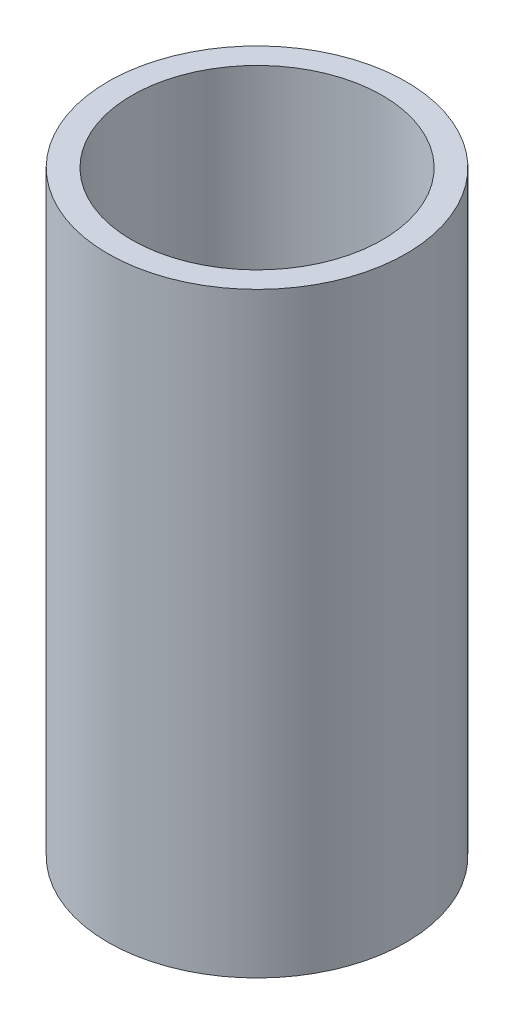
ISO-10303-21;
HEADER;
FILE_DESCRIPTION(('STEP AP214'),'2;1');
FILE_NAME('part.step','',(''),(''),'','','');
FILE_SCHEMA(('AUTOMOTIVE_DESIGN { 1 0 10303 214 1 1 1 1 }'));
ENDSEC;
DATA;
#1=APPLICATION_CONTEXT('core data for automotive mechanical design processes');
#2=APPLICATION_PROTOCOL_DEFINITION('international standard','automotive_design',2000,#1);
#3=PRODUCT_CONTEXT('',#1,'mechanical');
#4=PRODUCT('Part','Part','',(#3));
#5=PRODUCT_RELATED_PRODUCT_CATEGORY('part','',(#4));
#6=PRODUCT_DEFINITION_FORMATION('','',#4);
#7=PRODUCT_DEFINITION_CONTEXT('part definition',#1,'design');
#8=PRODUCT_DEFINITION('design','',#6,#7);
#9=PRODUCT_DEFINITION_SHAPE('','',#8);
#10=(LENGTH_UNIT() NAMED_UNIT(*) SI_UNIT(.MILLI.,.METRE.));
#11=(NAMED_UNIT(*) PLANE_ANGLE_UNIT() SI_UNIT($,.RADIAN.));
#12=(NAMED_UNIT(*) SI_UNIT($,.STERADIAN.) SOLID_ANGLE_UNIT());
#13=UNCERTAINTY_MEASURE_WITH_UNIT(LENGTH_MEASURE(1.E-05),#10,'distance_accuracy_value','');
#14=(GEOMETRIC_REPRESENTATION_CONTEXT(3) GLOBAL_UNCERTAINTY_ASSIGNED_CONTEXT((#13)) GLOBAL_UNIT_ASSIGNED_CONTEXT((#10,
#11,#12)) REPRESENTATION_CONTEXT('',''));
#15=CARTESIAN_POINT('',(0.,0.,0.));
#16=DIRECTION('',(0.,0.,1.));
#17=DIRECTION('',(1.,0.,0.));
#18=AXIS2_PLACEMENT_3D('',#15,#16,#17);
#19=CARTESIAN_POINT('',(0.,25.,0.));
#20=DIRECTION('',(0.,1.,0.));
#21=DIRECTION('',(0.,0.,1.));
#22=AXIS2_PLACEMENT_3D('',#19,#20,#21);
#23=PLANE('',#22);
#24=CARTESIAN_POINT('',(0.,25.,0.));
#25=DIRECTION('',(0.,1.,0.));
#26=DIRECTION('',(0.,0.,1.));
#27=AXIS2_PLACEMENT_3D('',#24,#25,#26);
#28=CIRCLE('',#27,12.5);
#29=CARTESIAN_POINT('',(0.,25.,12.5));
#30=VERTEX_POINT('',#29);
#31=EDGE_CURVE('E10',#30,#30,#28,.T.);
#32=ORIENTED_EDGE('',*,*,#31,.T.);
#33=EDGE_LOOP('',(#32));
#34=FACE_BOUND('',#33,.T.);
#35=CARTESIAN_POINT('',(0.,25.,0.));
#36=DIRECTION('',(0.,1.,0.));
#37=DIRECTION('',(0.,0.,1.));
#38=AXIS2_PLACEMENT_3D('',#35,#36,#37);
#39=CIRCLE('',#38,10.5);
#40=CARTESIAN_POINT('',(0.,25.,10.5));
#41=VERTEX_POINT('',#40);
#42=EDGE_CURVE('E42',#41,#41,#39,.T.);
#43=ORIENTED_EDGE('',*,*,#42,.F.);
#44=EDGE_LOOP('',(#43));
#45=FACE_BOUND('',#44,.T.);
#46=ADVANCED_FACE('F31',(#34,#45),#23,.T.);
#47=CARTESIAN_POINT('',(0.,-25.,0.));
#48=DIRECTION('',(0.,1.,0.));
#49=DIRECTION('',(0.,0.,1.));
#50=AXIS2_PLACEMENT_3D('',#47,#48,#49);
#51=PLANE('',#50);
#52=CARTESIAN_POINT('',(0.,-25.,0.));
#53=DIRECTION('',(0.,1.,0.));
#54=DIRECTION('',(0.,0.,1.));
#55=AXIS2_PLACEMENT_3D('',#52,#53,#54);
#56=CIRCLE('',#55,12.5);
#57=CARTESIAN_POINT('',(0.,-25.,12.5));
#58=VERTEX_POINT('',#57);
#59=EDGE_CURVE('E35',#58,#58,#56,.T.);
#60=ORIENTED_EDGE('',*,*,#59,.F.);
#61=EDGE_LOOP('',(#60));
#62=FACE_BOUND('',#61,.T.);
#63=CARTESIAN_POINT('',(0.,-25.,0.));
#64=DIRECTION('',(0.,1.,0.));
#65=DIRECTION('',(0.,0.,1.));
#66=AXIS2_PLACEMENT_3D('',#63,#64,#65);
#67=CIRCLE('',#66,10.5);
#68=CARTESIAN_POINT('',(0.,-25.,10.5));
#69=VERTEX_POINT('',#68);
#70=EDGE_CURVE('E44',#69,#69,#67,.T.);
#71=ORIENTED_EDGE('',*,*,#70,.T.);
#72=EDGE_LOOP('',(#71));
#73=FACE_BOUND('',#72,.T.);
#74=ADVANCED_FACE('F54',(#62,#73),#51,.F.);
#75=CARTESIAN_POINT('',(0.,25.,0.));
#76=DIRECTION('',(0.,-1.,0.));
#77=DIRECTION('',(0.,0.,-1.));
#78=AXIS2_PLACEMENT_3D('',#75,#76,#77);
#79=CYLINDRICAL_SURFACE('',#78,12.5);
#80=ORIENTED_EDGE('',*,*,#31,.F.);
#81=EDGE_LOOP('',(#80));
#82=FACE_BOUND('',#81,.T.);
#83=ORIENTED_EDGE('',*,*,#59,.T.);
#84=EDGE_LOOP('',(#83));
#85=FACE_BOUND('',#84,.T.);
#86=ADVANCED_FACE('F33',(#82,#85),#79,.T.);
#87=CARTESIAN_POINT('',(0.,25.,0.));
#88=DIRECTION('',(0.,-1.,0.));
#89=DIRECTION('',(0.,0.,-1.));
#90=AXIS2_PLACEMENT_3D('',#87,#88,#89);
#91=CYLINDRICAL_SURFACE('',#90,10.5);
#92=ORIENTED_EDGE('',*,*,#42,.T.);
#93=EDGE_LOOP('',(#92));
#94=FACE_BOUND('',#93,.T.);
#95=ORIENTED_EDGE('',*,*,#70,.F.);
#96=EDGE_LOOP('',(#95));
#97=FACE_BOUND('',#96,.T.);
#98=ADVANCED_FACE('F50',(#94,#97),#91,.F.);
#99=CLOSED_SHELL('',(#46,#74,#86,#98));
#100=MANIFOLD_SOLID_BREP('B2',#99);
#101=ADVANCED_BREP_SHAPE_REPRESENTATION('',(#18,#100),#14);
#102=SHAPE_DEFINITION_REPRESENTATION(#9,#101);
ENDSEC;
END-ISO-10303-21;
